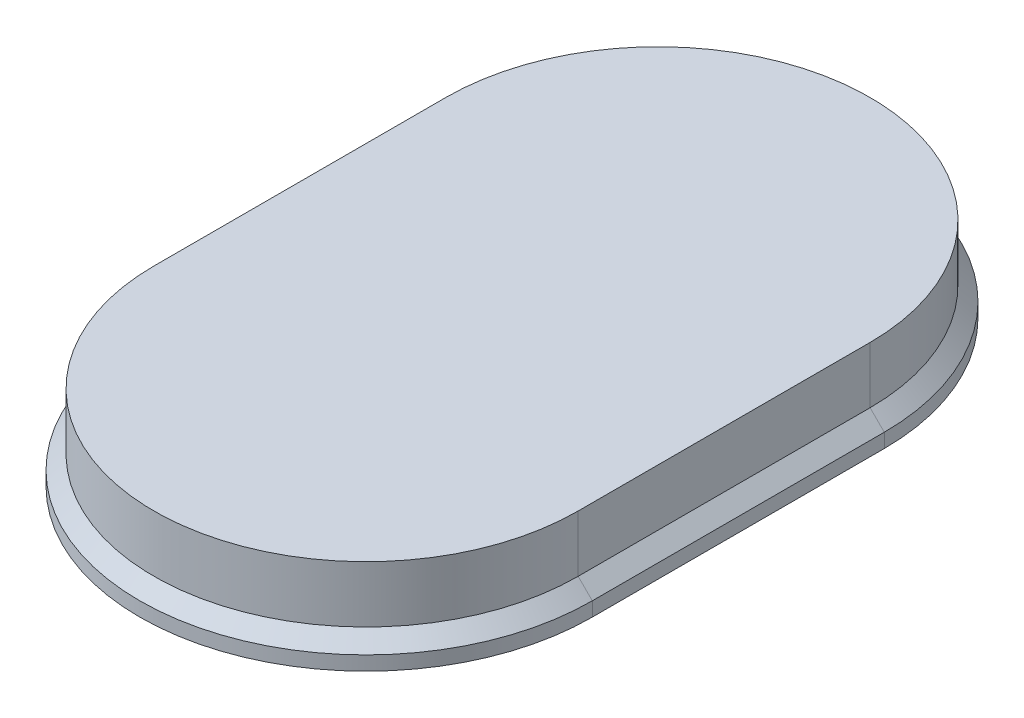
ISO-10303-21;
HEADER;
FILE_DESCRIPTION(('STEP AP214'),'2;1');
FILE_NAME('part.step','',(''),(''),'','','');
FILE_SCHEMA(('AUTOMOTIVE_DESIGN { 1 0 10303 214 1 1 1 1 }'));
ENDSEC;
DATA;
#1=APPLICATION_CONTEXT('core data for automotive mechanical design processes');
#2=APPLICATION_PROTOCOL_DEFINITION('international standard','automotive_design',2000,#1);
#3=PRODUCT_CONTEXT('',#1,'mechanical');
#4=PRODUCT('Part','Part','',(#3));
#5=PRODUCT_RELATED_PRODUCT_CATEGORY('part','',(#4));
#6=PRODUCT_DEFINITION_FORMATION('','',#4);
#7=PRODUCT_DEFINITION_CONTEXT('part definition',#1,'design');
#8=PRODUCT_DEFINITION('design','',#6,#7);
#9=PRODUCT_DEFINITION_SHAPE('','',#8);
#10=(LENGTH_UNIT() NAMED_UNIT(*) SI_UNIT(.MILLI.,.METRE.));
#11=(NAMED_UNIT(*) PLANE_ANGLE_UNIT() SI_UNIT($,.RADIAN.));
#12=(NAMED_UNIT(*) SI_UNIT($,.STERADIAN.) SOLID_ANGLE_UNIT());
#13=UNCERTAINTY_MEASURE_WITH_UNIT(LENGTH_MEASURE(1.E-05),#10,'distance_accuracy_value','');
#14=(GEOMETRIC_REPRESENTATION_CONTEXT(3) GLOBAL_UNCERTAINTY_ASSIGNED_CONTEXT((#13)) GLOBAL_UNIT_ASSIGNED_CONTEXT((#10,
#11,#12)) REPRESENTATION_CONTEXT('',''));
#15=CARTESIAN_POINT('',(0.,0.,0.));
#16=DIRECTION('',(0.,0.,1.));
#17=DIRECTION('',(1.,0.,0.));
#18=AXIS2_PLACEMENT_3D('',#15,#16,#17);
#19=CARTESIAN_POINT('',(0.,2.,-22.685905434569));
#20=DIRECTION('',(0.,-1.,0.));
#21=DIRECTION('',(0.,0.,-1.));
#22=AXIS2_PLACEMENT_3D('',#19,#20,#21);
#23=CYLINDRICAL_SURFACE('',#22,6.);
#24=DIRECTION('',(0.,-1.,0.));
#25=VECTOR('',#24,1.);
#26=CARTESIAN_POINT('',(6.,2.,-22.685905434569));
#27=LINE('',#26,#25);
#28=CARTESIAN_POINT('',(6.,2.,-22.685905434569));
#29=VERTEX_POINT('',#28);
#30=CARTESIAN_POINT('',(6.,0.399999999999998,-22.685905434569));
#31=VERTEX_POINT('',#30);
#32=EDGE_CURVE('E149',#29,#31,#27,.T.);
#33=ORIENTED_EDGE('',*,*,#32,.T.);
#34=CARTESIAN_POINT('',(0.,0.399999999999998,-22.685905434569));
#35=DIRECTION('',(0.,-1.,0.));
#36=DIRECTION('',(0.,0.,-1.));
#37=AXIS2_PLACEMENT_3D('',#34,#35,#36);
#38=CIRCLE('',#37,6.);
#39=CARTESIAN_POINT('',(-6.,0.399999999999998,-22.685905434569));
#40=VERTEX_POINT('',#39);
#41=EDGE_CURVE('E165',#31,#40,#38,.F.);
#42=ORIENTED_EDGE('',*,*,#41,.T.);
#43=DIRECTION('',(0.,-1.,0.));
#44=VECTOR('',#43,1.);
#45=CARTESIAN_POINT('',(-6.,2.,-22.685905434569));
#46=LINE('',#45,#44);
#47=CARTESIAN_POINT('',(-6.,2.,-22.685905434569));
#48=VERTEX_POINT('',#47);
#49=EDGE_CURVE('E156',#48,#40,#46,.T.);
#50=ORIENTED_EDGE('',*,*,#49,.F.);
#51=CARTESIAN_POINT('',(0.,2.,-22.685905434569));
#52=DIRECTION('',(0.,1.,0.));
#53=DIRECTION('',(0.,0.,1.));
#54=AXIS2_PLACEMENT_3D('',#51,#52,#53);
#55=CIRCLE('',#54,6.);
#56=EDGE_CURVE('E135',#29,#48,#55,.T.);
#57=ORIENTED_EDGE('',*,*,#56,.F.);
#58=EDGE_LOOP('',(#33,#42,#50,#57));
#59=FACE_BOUND('',#58,.T.);
#60=ADVANCED_FACE('F41',(#59),#23,.T.);
#61=CARTESIAN_POINT('',(-6.,2.,-22.685905434569));
#62=DIRECTION('',(1.,0.,0.));
#63=DIRECTION('',(0.,0.,-1.));
#64=AXIS2_PLACEMENT_3D('',#61,#62,#63);
#65=PLANE('',#64);
#66=ORIENTED_EDGE('',*,*,#49,.T.);
#67=DIRECTION('',(0.,0.,1.));
#68=VECTOR('',#67,1.);
#69=CARTESIAN_POINT('',(-6.,0.399999999999998,-14.4284741891059));
#70=LINE('',#69,#68);
#71=CARTESIAN_POINT('',(-6.,0.399999999999998,-14.4284741891059));
#72=VERTEX_POINT('',#71);
#73=EDGE_CURVE('E65',#40,#72,#70,.T.);
#74=ORIENTED_EDGE('',*,*,#73,.T.);
#75=DIRECTION('',(0.,-1.,0.));
#76=VECTOR('',#75,1.);
#77=CARTESIAN_POINT('',(-6.,2.,-14.4284741891059));
#78=LINE('',#77,#76);
#79=CARTESIAN_POINT('',(-6.,2.,-14.4284741891059));
#80=VERTEX_POINT('',#79);
#81=EDGE_CURVE('E154',#80,#72,#78,.T.);
#82=ORIENTED_EDGE('',*,*,#81,.F.);
#83=DIRECTION('',(0.,0.,1.));
#84=VECTOR('',#83,1.);
#85=CARTESIAN_POINT('',(-6.,2.,-22.685905434569));
#86=LINE('',#85,#84);
#87=EDGE_CURVE('E138',#48,#80,#86,.T.);
#88=ORIENTED_EDGE('',*,*,#87,.F.);
#89=EDGE_LOOP('',(#66,#74,#82,#88));
#90=FACE_BOUND('',#89,.T.);
#91=ADVANCED_FACE('F226',(#90),#65,.F.);
#92=CARTESIAN_POINT('',(0.,2.,-14.4284741891058));
#93=DIRECTION('',(0.,-1.,0.));
#94=DIRECTION('',(0.,0.,-1.));
#95=AXIS2_PLACEMENT_3D('',#92,#93,#94);
#96=CYLINDRICAL_SURFACE('',#95,6.);
#97=ORIENTED_EDGE('',*,*,#81,.T.);
#98=CARTESIAN_POINT('',(0.,0.399999999999998,-14.4284741891058));
#99=DIRECTION('',(0.,-1.,0.));
#100=DIRECTION('',(0.,0.,-1.));
#101=AXIS2_PLACEMENT_3D('',#98,#99,#100);
#102=CIRCLE('',#101,6.);
#103=CARTESIAN_POINT('',(6.,0.399999999999998,-14.4284741891058));
#104=VERTEX_POINT('',#103);
#105=EDGE_CURVE('E12',#72,#104,#102,.F.);
#106=ORIENTED_EDGE('',*,*,#105,.T.);
#107=DIRECTION('',(0.,-1.,0.));
#108=VECTOR('',#107,1.);
#109=CARTESIAN_POINT('',(6.,2.,-14.4284741891058));
#110=LINE('',#109,#108);
#111=CARTESIAN_POINT('',(6.,2.,-14.4284741891058));
#112=VERTEX_POINT('',#111);
#113=EDGE_CURVE('E152',#112,#104,#110,.T.);
#114=ORIENTED_EDGE('',*,*,#113,.F.);
#115=CARTESIAN_POINT('',(0.,2.,-14.4284741891058));
#116=DIRECTION('',(0.,1.,0.));
#117=DIRECTION('',(0.,0.,1.));
#118=AXIS2_PLACEMENT_3D('',#115,#116,#117);
#119=CIRCLE('',#118,6.);
#120=EDGE_CURVE('E145',#80,#112,#119,.T.);
#121=ORIENTED_EDGE('',*,*,#120,.F.);
#122=EDGE_LOOP('',(#97,#106,#114,#121));
#123=FACE_BOUND('',#122,.T.);
#124=ADVANCED_FACE('F232',(#123),#96,.T.);
#125=CARTESIAN_POINT('',(6.,2.,-22.685905434569));
#126=DIRECTION('',(-1.,0.,0.));
#127=DIRECTION('',(0.,0.,1.));
#128=AXIS2_PLACEMENT_3D('',#125,#126,#127);
#129=PLANE('',#128);
#130=ORIENTED_EDGE('',*,*,#113,.T.);
#131=DIRECTION('',(0.,0.,-1.));
#132=VECTOR('',#131,1.);
#133=CARTESIAN_POINT('',(6.,0.399999999999998,-22.685905434569));
#134=LINE('',#133,#132);
#135=EDGE_CURVE('E51',#104,#31,#134,.T.);
#136=ORIENTED_EDGE('',*,*,#135,.T.);
#137=ORIENTED_EDGE('',*,*,#32,.F.);
#138=DIRECTION('',(0.,0.,-1.));
#139=VECTOR('',#138,1.);
#140=CARTESIAN_POINT('',(6.,2.,-22.685905434569));
#141=LINE('',#140,#139);
#142=EDGE_CURVE('E147',#112,#29,#141,.T.);
#143=ORIENTED_EDGE('',*,*,#142,.F.);
#144=EDGE_LOOP('',(#130,#136,#137,#143));
#145=FACE_BOUND('',#144,.T.);
#146=ADVANCED_FACE('F292',(#145),#129,.F.);
#147=CARTESIAN_POINT('',(0.,2.,-22.685905434569));
#148=DIRECTION('',(0.,1.,0.));
#149=DIRECTION('',(0.,0.,1.));
#150=AXIS2_PLACEMENT_3D('',#147,#148,#149);
#151=PLANE('',#150);
#152=ORIENTED_EDGE('',*,*,#56,.T.);
#153=ORIENTED_EDGE('',*,*,#87,.T.);
#154=ORIENTED_EDGE('',*,*,#120,.T.);
#155=ORIENTED_EDGE('',*,*,#142,.T.);
#156=EDGE_LOOP('',(#152,#153,#154,#155));
#157=FACE_BOUND('',#156,.T.);
#158=ADVANCED_FACE('F288',(#157),#151,.T.);
#159=CARTESIAN_POINT('',(0.,-0.4,-22.685905434569));
#160=DIRECTION('',(0.,1.,0.));
#161=DIRECTION('',(0.,0.,1.));
#162=AXIS2_PLACEMENT_3D('',#159,#160,#161);
#163=CYLINDRICAL_SURFACE('',#162,6.4);
#164=CARTESIAN_POINT('',(0.,0.,-22.685905434569));
#165=DIRECTION('',(0.,-1.,0.));
#166=DIRECTION('',(0.,0.,-1.));
#167=AXIS2_PLACEMENT_3D('',#164,#165,#166);
#168=CIRCLE('',#167,6.4);
#169=CARTESIAN_POINT('',(-6.4,0.,-22.685905434569));
#170=VERTEX_POINT('',#169);
#171=CARTESIAN_POINT('',(6.4,0.,-22.685905434569));
#172=VERTEX_POINT('',#171);
#173=EDGE_CURVE('E134',#170,#172,#168,.T.);
#174=ORIENTED_EDGE('',*,*,#173,.T.);
#175=DIRECTION('',(0.,1.,0.));
#176=VECTOR('',#175,1.);
#177=CARTESIAN_POINT('',(6.4,-0.4,-22.685905434569));
#178=LINE('',#177,#176);
#179=CARTESIAN_POINT('',(6.4,-0.4,-22.685905434569));
#180=VERTEX_POINT('',#179);
#181=EDGE_CURVE('E114',#180,#172,#178,.T.);
#182=ORIENTED_EDGE('',*,*,#181,.F.);
#183=CARTESIAN_POINT('',(0.,-0.4,-22.685905434569));
#184=DIRECTION('',(0.,-1.,0.));
#185=DIRECTION('',(0.,0.,-1.));
#186=AXIS2_PLACEMENT_3D('',#183,#184,#185);
#187=CIRCLE('',#186,6.4);
#188=CARTESIAN_POINT('',(-6.4,-0.4,-22.685905434569));
#189=VERTEX_POINT('',#188);
#190=EDGE_CURVE('E121',#189,#180,#187,.T.);
#191=ORIENTED_EDGE('',*,*,#190,.F.);
#192=DIRECTION('',(0.,1.,0.));
#193=VECTOR('',#192,1.);
#194=CARTESIAN_POINT('',(-6.4,-0.4,-22.685905434569));
#195=LINE('',#194,#193);
#196=EDGE_CURVE('E192',#189,#170,#195,.T.);
#197=ORIENTED_EDGE('',*,*,#196,.T.);
#198=EDGE_LOOP('',(#174,#182,#191,#197));
#199=FACE_BOUND('',#198,.T.);
#200=ADVANCED_FACE('F132',(#199),#163,.T.);
#201=CARTESIAN_POINT('',(6.4,-0.4,-22.685905434569));
#202=DIRECTION('',(-1.,0.,0.));
#203=DIRECTION('',(0.,0.,1.));
#204=AXIS2_PLACEMENT_3D('',#201,#202,#203);
#205=PLANE('',#204);
#206=DIRECTION('',(0.,0.,1.));
#207=VECTOR('',#206,1.);
#208=CARTESIAN_POINT('',(6.4,0.,-22.685905434569));
#209=LINE('',#208,#207);
#210=CARTESIAN_POINT('',(6.4,0.,-14.4284741891058));
#211=VERTEX_POINT('',#210);
#212=EDGE_CURVE('E183',#172,#211,#209,.T.);
#213=ORIENTED_EDGE('',*,*,#212,.T.);
#214=DIRECTION('',(0.,1.,0.));
#215=VECTOR('',#214,1.);
#216=CARTESIAN_POINT('',(6.4,-0.4,-14.4284741891058));
#217=LINE('',#216,#215);
#218=CARTESIAN_POINT('',(6.4,-0.4,-14.4284741891058));
#219=VERTEX_POINT('',#218);
#220=EDGE_CURVE('E117',#219,#211,#217,.T.);
#221=ORIENTED_EDGE('',*,*,#220,.F.);
#222=DIRECTION('',(0.,0.,1.));
#223=VECTOR('',#222,1.);
#224=CARTESIAN_POINT('',(6.4,-0.4,-22.685905434569));
#225=LINE('',#224,#223);
#226=EDGE_CURVE('E110',#180,#219,#225,.T.);
#227=ORIENTED_EDGE('',*,*,#226,.F.);
#228=ORIENTED_EDGE('',*,*,#181,.T.);
#229=EDGE_LOOP('',(#213,#221,#227,#228));
#230=FACE_BOUND('',#229,.T.);
#231=ADVANCED_FACE('F112',(#230),#205,.F.);
#232=CARTESIAN_POINT('',(0.,-0.4,-14.4284741891058));
#233=DIRECTION('',(0.,1.,0.));
#234=DIRECTION('',(0.,0.,1.));
#235=AXIS2_PLACEMENT_3D('',#232,#233,#234);
#236=CYLINDRICAL_SURFACE('',#235,6.4);
#237=CARTESIAN_POINT('',(0.,0.,-14.4284741891058));
#238=DIRECTION('',(0.,-1.,0.));
#239=DIRECTION('',(0.,0.,-1.));
#240=AXIS2_PLACEMENT_3D('',#237,#238,#239);
#241=CIRCLE('',#240,6.4);
#242=CARTESIAN_POINT('',(-6.4,0.,-14.4284741891058));
#243=VERTEX_POINT('',#242);
#244=EDGE_CURVE('E185',#211,#243,#241,.T.);
#245=ORIENTED_EDGE('',*,*,#244,.T.);
#246=DIRECTION('',(0.,1.,0.));
#247=VECTOR('',#246,1.);
#248=CARTESIAN_POINT('',(-6.4,-0.4,-14.4284741891058));
#249=LINE('',#248,#247);
#250=CARTESIAN_POINT('',(-6.4,-0.4,-14.4284741891058));
#251=VERTEX_POINT('',#250);
#252=EDGE_CURVE('E140',#251,#243,#249,.T.);
#253=ORIENTED_EDGE('',*,*,#252,.F.);
#254=CARTESIAN_POINT('',(0.,-0.4,-14.4284741891058));
#255=DIRECTION('',(0.,-1.,0.));
#256=DIRECTION('',(0.,0.,-1.));
#257=AXIS2_PLACEMENT_3D('',#254,#255,#256);
#258=CIRCLE('',#257,6.4);
#259=EDGE_CURVE('E120',#219,#251,#258,.T.);
#260=ORIENTED_EDGE('',*,*,#259,.F.);
#261=ORIENTED_EDGE('',*,*,#220,.T.);
#262=EDGE_LOOP('',(#245,#253,#260,#261));
#263=FACE_BOUND('',#262,.T.);
#264=ADVANCED_FACE('F207',(#263),#236,.T.);
#265=CARTESIAN_POINT('',(-6.4,-0.4,-14.4284741891058));
#266=DIRECTION('',(1.,0.,0.));
#267=DIRECTION('',(0.,0.,-1.));
#268=AXIS2_PLACEMENT_3D('',#265,#266,#267);
#269=PLANE('',#268);
#270=DIRECTION('',(0.,0.,-1.));
#271=VECTOR('',#270,1.);
#272=CARTESIAN_POINT('',(-6.4,0.,-14.4284741891058));
#273=LINE('',#272,#271);
#274=EDGE_CURVE('E130',#243,#170,#273,.T.);
#275=ORIENTED_EDGE('',*,*,#274,.T.);
#276=ORIENTED_EDGE('',*,*,#196,.F.);
#277=DIRECTION('',(0.,0.,-1.));
#278=VECTOR('',#277,1.);
#279=CARTESIAN_POINT('',(-6.4,-0.4,-14.4284741891058));
#280=LINE('',#279,#278);
#281=EDGE_CURVE('E126',#251,#189,#280,.T.);
#282=ORIENTED_EDGE('',*,*,#281,.F.);
#283=ORIENTED_EDGE('',*,*,#252,.T.);
#284=EDGE_LOOP('',(#275,#276,#282,#283));
#285=FACE_BOUND('',#284,.T.);
#286=ADVANCED_FACE('F196',(#285),#269,.F.);
#287=CARTESIAN_POINT('',(0.,-0.4,-22.685905434569));
#288=DIRECTION('',(0.,-1.,0.));
#289=DIRECTION('',(0.,0.,-1.));
#290=AXIS2_PLACEMENT_3D('',#287,#288,#289);
#291=PLANE('',#290);
#292=CARTESIAN_POINT('',(0.,-0.4,-22.685905434569));
#293=DIRECTION('',(0.,-1.,0.));
#294=DIRECTION('',(0.,0.,-1.));
#295=AXIS2_PLACEMENT_3D('',#292,#293,#294);
#296=CIRCLE('',#295,2.5);
#297=CARTESIAN_POINT('',(0.,-0.400000000000001,-20.185905434569));
#298=VERTEX_POINT('',#297);
#299=EDGE_CURVE('E158',#298,#298,#296,.T.);
#300=ORIENTED_EDGE('',*,*,#299,.F.);
#301=EDGE_LOOP('',(#300));
#302=FACE_BOUND('',#301,.T.);
#303=ORIENTED_EDGE('',*,*,#190,.T.);
#304=ORIENTED_EDGE('',*,*,#226,.T.);
#305=ORIENTED_EDGE('',*,*,#259,.T.);
#306=ORIENTED_EDGE('',*,*,#281,.T.);
#307=EDGE_LOOP('',(#303,#304,#305,#306));
#308=FACE_BOUND('',#307,.T.);
#309=ADVANCED_FACE('F124',(#302,#308),#291,.T.);
#310=CARTESIAN_POINT('',(0.,-11.0710678118655,-22.685905434569));
#311=DIRECTION('',(0.,1.,0.));
#312=DIRECTION('',(0.,0.,1.));
#313=AXIS2_PLACEMENT_3D('',#310,#311,#312);
#314=CYLINDRICAL_SURFACE('',#313,2.5);
#315=CARTESIAN_POINT('',(0.,-1.00000000000001,-22.685905434569));
#316=DIRECTION('',(0.,-1.,0.));
#317=DIRECTION('',(0.,0.,-1.));
#318=AXIS2_PLACEMENT_3D('',#315,#316,#317);
#319=CIRCLE('',#318,2.5);
#320=CARTESIAN_POINT('',(0.,-1.00000000000001,-20.185905434569));
#321=VERTEX_POINT('',#320);
#322=EDGE_CURVE('E162',#321,#321,#319,.F.);
#323=CARTESIAN_POINT('',(0.,-1.00000000000001,-20.185905434569));
#324=CARTESIAN_POINT('',(0.,-0.993750000000008,-20.185905434569));
#325=CARTESIAN_POINT('',(0.,-0.987500000000008,-20.185905434569));
#326=CARTESIAN_POINT('',(0.,-0.975000000000008,-20.185905434569));
#327=CARTESIAN_POINT('',(0.,-0.968750000000007,-20.185905434569));
#328=CARTESIAN_POINT('',(0.,-0.956250000000007,-20.185905434569));
#329=CARTESIAN_POINT('',(0.,-0.950000000000007,-20.185905434569));
#330=CARTESIAN_POINT('',(0.,-0.937500000000007,-20.185905434569));
#331=CARTESIAN_POINT('',(0.,-0.931250000000007,-20.185905434569));
#332=CARTESIAN_POINT('',(0.,-0.918750000000007,-20.185905434569));
#333=CARTESIAN_POINT('',(0.,-0.912500000000007,-20.185905434569));
#334=CARTESIAN_POINT('',(0.,-0.900000000000006,-20.185905434569));
#335=CARTESIAN_POINT('',(0.,-0.893750000000006,-20.185905434569));
#336=CARTESIAN_POINT('',(0.,-0.881250000000007,-20.185905434569));
#337=CARTESIAN_POINT('',(0.,-0.875000000000007,-20.185905434569));
#338=CARTESIAN_POINT('',(0.,-0.862500000000007,-20.185905434569));
#339=CARTESIAN_POINT('',(0.,-0.856250000000007,-20.185905434569));
#340=CARTESIAN_POINT('',(0.,-0.843750000000007,-20.185905434569));
#341=CARTESIAN_POINT('',(0.,-0.837500000000006,-20.185905434569));
#342=CARTESIAN_POINT('',(0.,-0.825000000000006,-20.185905434569));
#343=CARTESIAN_POINT('',(0.,-0.818750000000006,-20.185905434569));
#344=CARTESIAN_POINT('',(0.,-0.806250000000006,-20.185905434569));
#345=CARTESIAN_POINT('',(0.,-0.800000000000006,-20.185905434569));
#346=CARTESIAN_POINT('',(0.,-0.787500000000006,-20.185905434569));
#347=CARTESIAN_POINT('',(0.,-0.781250000000005,-20.185905434569));
#348=CARTESIAN_POINT('',(0.,-0.768750000000005,-20.185905434569));
#349=CARTESIAN_POINT('',(0.,-0.762500000000005,-20.185905434569));
#350=CARTESIAN_POINT('',(0.,-0.750000000000005,-20.185905434569));
#351=CARTESIAN_POINT('',(0.,-0.743750000000005,-20.185905434569));
#352=CARTESIAN_POINT('',(0.,-0.731250000000005,-20.185905434569));
#353=CARTESIAN_POINT('',(0.,-0.725000000000005,-20.185905434569));
#354=CARTESIAN_POINT('',(0.,-0.712500000000004,-20.185905434569));
#355=CARTESIAN_POINT('',(0.,-0.706250000000004,-20.185905434569));
#356=CARTESIAN_POINT('',(0.,-0.693750000000005,-20.185905434569));
#357=CARTESIAN_POINT('',(0.,-0.687500000000005,-20.185905434569));
#358=CARTESIAN_POINT('',(0.,-0.675000000000004,-20.185905434569));
#359=CARTESIAN_POINT('',(0.,-0.668750000000004,-20.185905434569));
#360=CARTESIAN_POINT('',(0.,-0.656250000000004,-20.185905434569));
#361=CARTESIAN_POINT('',(0.,-0.650000000000004,-20.185905434569));
#362=CARTESIAN_POINT('',(0.,-0.637500000000004,-20.185905434569));
#363=CARTESIAN_POINT('',(0.,-0.631250000000004,-20.185905434569));
#364=CARTESIAN_POINT('',(0.,-0.618750000000004,-20.185905434569));
#365=CARTESIAN_POINT('',(0.,-0.612500000000003,-20.185905434569));
#366=CARTESIAN_POINT('',(0.,-0.600000000000003,-20.185905434569));
#367=CARTESIAN_POINT('',(0.,-0.593750000000003,-20.185905434569));
#368=CARTESIAN_POINT('',(0.,-0.581250000000003,-20.185905434569));
#369=CARTESIAN_POINT('',(0.,-0.575000000000003,-20.185905434569));
#370=CARTESIAN_POINT('',(0.,-0.562500000000003,-20.185905434569));
#371=CARTESIAN_POINT('',(0.,-0.556250000000002,-20.185905434569));
#372=CARTESIAN_POINT('',(0.,-0.543750000000002,-20.185905434569));
#373=CARTESIAN_POINT('',(0.,-0.537500000000002,-20.185905434569));
#374=CARTESIAN_POINT('',(0.,-0.525000000000002,-20.185905434569));
#375=CARTESIAN_POINT('',(0.,-0.518750000000002,-20.185905434569));
#376=CARTESIAN_POINT('',(0.,-0.506250000000003,-20.185905434569));
#377=CARTESIAN_POINT('',(0.,-0.500000000000003,-20.185905434569));
#378=CARTESIAN_POINT('',(0.,-0.487500000000002,-20.185905434569));
#379=CARTESIAN_POINT('',(0.,-0.481250000000002,-20.185905434569));
#380=CARTESIAN_POINT('',(0.,-0.468750000000002,-20.185905434569));
#381=CARTESIAN_POINT('',(0.,-0.462500000000002,-20.185905434569));
#382=CARTESIAN_POINT('',(0.,-0.450000000000002,-20.185905434569));
#383=CARTESIAN_POINT('',(0.,-0.443750000000002,-20.185905434569));
#384=CARTESIAN_POINT('',(0.,-0.431250000000002,-20.185905434569));
#385=CARTESIAN_POINT('',(0.,-0.425000000000001,-20.185905434569));
#386=CARTESIAN_POINT('',(0.,-0.412500000000001,-20.185905434569));
#387=CARTESIAN_POINT('',(0.,-0.406250000000001,-20.185905434569));
#388=CARTESIAN_POINT('',(0.,-0.400000000000001,-20.185905434569));
#389=B_SPLINE_CURVE_WITH_KNOTS('',3,(#323,#324,#325,#326,#327,#328,#329,#330,#331,#332,#333,
#334,#335,#336,#337,#338,#339,#340,#341,#342,#343,#344,#345,#346,#347,#348,#349,#350,#351,#352,
#353,#354,#355,#356,#357,#358,#359,#360,#361,#362,#363,#364,#365,#366,#367,#368,#369,#370,#371,
#372,#373,#374,#375,#376,#377,#378,#379,#380,#381,#382,#383,#384,#385,#386,#387,#388),
.UNSPECIFIED.,.F.,.F.,(4,2,2,2,2,2,2,2,2,2,2,2,2,2,2,2,2,2,2,2,2,2,2,2,2,2,2,2,2,2,2,2,4),(0.,
0.0187499999999997,0.0375000000000011,0.0562500000000007,0.0750000000000004,0.0937500000000018,
0.112500000000001,0.131250000000001,0.150000000000001,0.168750000000002,0.187500000000002,
0.206250000000002,0.225000000000003,0.243750000000003,0.262500000000002,0.281250000000004,
0.300000000000003,0.318750000000003,0.337500000000004,0.356250000000004,0.375000000000004,
0.393750000000005,0.412500000000005,0.431250000000005,0.450000000000006,0.468750000000006,
0.487500000000005,0.506250000000005,0.525000000000006,0.543750000000006,0.562500000000006,
0.581250000000007,0.600000000000007),.UNSPECIFIED.);
#390=EDGE_CURVE('BSEAM212',#321,#298,#389,.T.);
#391=ORIENTED_EDGE('',*,*,#322,.T.);
#392=ORIENTED_EDGE('',*,*,#299,.T.);
#393=ORIENTED_EDGE('',*,*,#390,.T.);
#394=ORIENTED_EDGE('',*,*,#390,.F.);
#395=EDGE_LOOP('',(#391,#393,#392,#394));
#396=FACE_BOUND('',#395,.T.);
#397=ADVANCED_FACE('F212',(#396),#314,.T.);
#398=CARTESIAN_POINT('',(0.,-2.,-22.685905434569));
#399=DIRECTION('',(0.,-1.,0.));
#400=DIRECTION('',(0.,0.,-1.));
#401=AXIS2_PLACEMENT_3D('',#398,#399,#400);
#402=PLANE('',#401);
#403=CARTESIAN_POINT('',(0.,-2.,-22.685905434569));
#404=DIRECTION('',(0.,-1.,0.));
#405=DIRECTION('',(0.,0.,-1.));
#406=AXIS2_PLACEMENT_3D('',#403,#404,#405);
#407=CIRCLE('',#406,1.50000000000001);
#408=CARTESIAN_POINT('',(0.,-2.,-24.185905434569));
#409=VERTEX_POINT('',#408);
#410=EDGE_CURVE('E159',#409,#409,#407,.T.);
#411=ORIENTED_EDGE('',*,*,#410,.T.);
#412=EDGE_LOOP('',(#411));
#413=FACE_BOUND('',#412,.T.);
#414=ADVANCED_FACE('F220',(#413),#402,.T.);
#415=CARTESIAN_POINT('',(0.,-2.,-22.685905434569));
#416=DIRECTION('',(0.,1.,0.));
#417=DIRECTION('',(0.,0.,1.));
#418=AXIS2_PLACEMENT_3D('',#415,#416,#417);
#419=CONICAL_SURFACE('',#418,1.50000000000001,0.785398163397446);
#420=ORIENTED_EDGE('',*,*,#322,.F.);
#421=EDGE_LOOP('',(#420));
#422=FACE_BOUND('',#421,.T.);
#423=ORIENTED_EDGE('',*,*,#410,.F.);
#424=EDGE_LOOP('',(#423));
#425=FACE_BOUND('',#424,.T.);
#426=ADVANCED_FACE('F237',(#422,#425),#419,.T.);
#427=CARTESIAN_POINT('',(0.,0.399999999999998,-14.4284741891058));
#428=DIRECTION('',(0.,-1.,0.));
#429=DIRECTION('',(0.,0.,-1.));
#430=AXIS2_PLACEMENT_3D('',#427,#428,#429);
#431=CONICAL_SURFACE('',#430,6.,0.785398163397448);
#432=DIRECTION('',(0.707106781186548,0.707106781186548,0.));
#433=VECTOR('',#432,1.);
#434=CARTESIAN_POINT('',(-6.4,0.,-14.4284741891059));
#435=LINE('',#434,#433);
#436=EDGE_CURVE('E173',#243,#72,#435,.T.);
#437=ORIENTED_EDGE('',*,*,#436,.F.);
#438=ORIENTED_EDGE('',*,*,#244,.F.);
#439=DIRECTION('',(0.707106781186548,-0.707106781186548,0.));
#440=VECTOR('',#439,1.);
#441=CARTESIAN_POINT('',(6.,0.399999999999998,-14.4284741891058));
#442=LINE('',#441,#440);
#443=EDGE_CURVE('E46',#104,#211,#442,.T.);
#444=ORIENTED_EDGE('',*,*,#443,.F.);
#445=ORIENTED_EDGE('',*,*,#105,.F.);
#446=EDGE_LOOP('',(#437,#438,#444,#445));
#447=FACE_BOUND('',#446,.T.);
#448=ADVANCED_FACE('F44',(#447),#431,.T.);
#449=CARTESIAN_POINT('',(6.,0.399999999999998,-22.685905434569));
#450=DIRECTION('',(0.707106781186548,0.707106781186548,0.));
#451=DIRECTION('',(0.,0.,1.));
#452=AXIS2_PLACEMENT_3D('',#449,#450,#451);
#453=PLANE('',#452);
#454=ORIENTED_EDGE('',*,*,#443,.T.);
#455=ORIENTED_EDGE('',*,*,#212,.F.);
#456=DIRECTION('',(0.707106781186548,-0.707106781186548,0.));
#457=VECTOR('',#456,1.);
#458=CARTESIAN_POINT('',(6.,0.399999999999998,-22.685905434569));
#459=LINE('',#458,#457);
#460=EDGE_CURVE('E172',#31,#172,#459,.T.);
#461=ORIENTED_EDGE('',*,*,#460,.F.);
#462=ORIENTED_EDGE('',*,*,#135,.F.);
#463=EDGE_LOOP('',(#454,#455,#461,#462));
#464=FACE_BOUND('',#463,.T.);
#465=ADVANCED_FACE('F206',(#464),#453,.T.);
#466=CARTESIAN_POINT('',(-6.,0.399999999999998,-22.685905434569));
#467=DIRECTION('',(-0.707106781186548,0.707106781186548,0.));
#468=DIRECTION('',(0.,0.,-1.));
#469=AXIS2_PLACEMENT_3D('',#466,#467,#468);
#470=PLANE('',#469);
#471=ORIENTED_EDGE('',*,*,#436,.T.);
#472=ORIENTED_EDGE('',*,*,#73,.F.);
#473=DIRECTION('',(0.707106781186548,0.707106781186548,0.));
#474=VECTOR('',#473,1.);
#475=CARTESIAN_POINT('',(-6.4,0.,-22.685905434569));
#476=LINE('',#475,#474);
#477=EDGE_CURVE('E170',#170,#40,#476,.T.);
#478=ORIENTED_EDGE('',*,*,#477,.F.);
#479=ORIENTED_EDGE('',*,*,#274,.F.);
#480=EDGE_LOOP('',(#471,#472,#478,#479));
#481=FACE_BOUND('',#480,.T.);
#482=ADVANCED_FACE('F201',(#481),#470,.T.);
#483=CARTESIAN_POINT('',(0.,0.399999999999998,-22.685905434569));
#484=DIRECTION('',(0.,-1.,0.));
#485=DIRECTION('',(0.,0.,-1.));
#486=AXIS2_PLACEMENT_3D('',#483,#484,#485);
#487=CONICAL_SURFACE('',#486,6.,0.785398163397448);
#488=ORIENTED_EDGE('',*,*,#460,.T.);
#489=ORIENTED_EDGE('',*,*,#173,.F.);
#490=ORIENTED_EDGE('',*,*,#477,.T.);
#491=ORIENTED_EDGE('',*,*,#41,.F.);
#492=EDGE_LOOP('',(#488,#489,#490,#491));
#493=FACE_BOUND('',#492,.T.);
#494=ADVANCED_FACE('F204',(#493),#487,.T.);
#495=CLOSED_SHELL('',(#60,#91,#124,#146,#158,#200,#231,#264,#286,#309,#397,#414,#426,#448,#465,
#482,#494));
#496=MANIFOLD_SOLID_BREP('B2',#495);
#497=ADVANCED_BREP_SHAPE_REPRESENTATION('',(#18,#496),#14);
#498=SHAPE_DEFINITION_REPRESENTATION(#9,#497);
ENDSEC;
END-ISO-10303-21;
